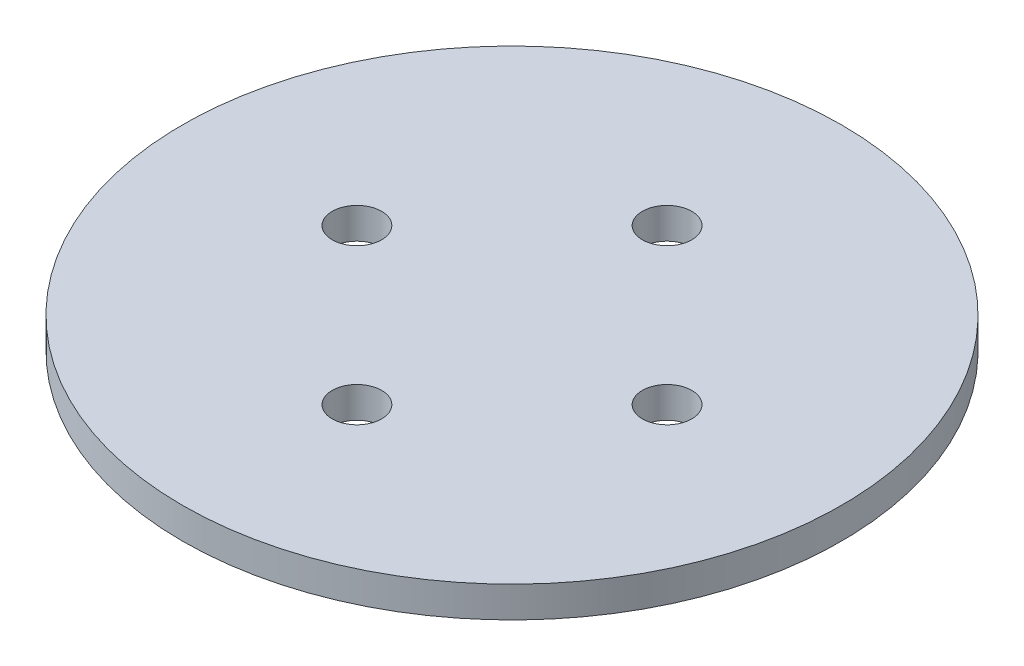
ISO-10303-21;
HEADER;
FILE_DESCRIPTION(('STEP AP214'),'2;1');
FILE_NAME('part.step','',(''),(''),'','','');
FILE_SCHEMA(('AUTOMOTIVE_DESIGN { 1 0 10303 214 1 1 1 1 }'));
ENDSEC;
DATA;
#1=APPLICATION_CONTEXT('core data for automotive mechanical design processes');
#2=APPLICATION_PROTOCOL_DEFINITION('international standard','automotive_design',2000,#1);
#3=PRODUCT_CONTEXT('',#1,'mechanical');
#4=PRODUCT('Part','Part','',(#3));
#5=PRODUCT_RELATED_PRODUCT_CATEGORY('part','',(#4));
#6=PRODUCT_DEFINITION_FORMATION('','',#4);
#7=PRODUCT_DEFINITION_CONTEXT('part definition',#1,'design');
#8=PRODUCT_DEFINITION('design','',#6,#7);
#9=PRODUCT_DEFINITION_SHAPE('','',#8);
#10=(LENGTH_UNIT() NAMED_UNIT(*) SI_UNIT(.MILLI.,.METRE.));
#11=(NAMED_UNIT(*) PLANE_ANGLE_UNIT() SI_UNIT($,.RADIAN.));
#12=(NAMED_UNIT(*) SI_UNIT($,.STERADIAN.) SOLID_ANGLE_UNIT());
#13=UNCERTAINTY_MEASURE_WITH_UNIT(LENGTH_MEASURE(1.E-05),#10,'distance_accuracy_value','');
#14=(GEOMETRIC_REPRESENTATION_CONTEXT(3) GLOBAL_UNCERTAINTY_ASSIGNED_CONTEXT((#13)) GLOBAL_UNIT_ASSIGNED_CONTEXT((#10,
#11,#12)) REPRESENTATION_CONTEXT('',''));
#15=CARTESIAN_POINT('',(0.,0.,0.));
#16=DIRECTION('',(0.,0.,1.));
#17=DIRECTION('',(1.,0.,0.));
#18=AXIS2_PLACEMENT_3D('',#15,#16,#17);
#19=CARTESIAN_POINT('',(0.,1.6,0.));
#20=DIRECTION('',(0.,-1.,0.));
#21=DIRECTION('',(0.,0.,-1.));
#22=AXIS2_PLACEMENT_3D('',#19,#20,#21);
#23=CYLINDRICAL_SURFACE('',#22,17.);
#24=CARTESIAN_POINT('',(0.,1.6,0.));
#25=DIRECTION('',(0.,1.,0.));
#26=DIRECTION('',(0.,0.,1.));
#27=AXIS2_PLACEMENT_3D('',#24,#25,#26);
#28=CIRCLE('',#27,17.);
#29=CARTESIAN_POINT('',(0.,1.6,17.));
#30=VERTEX_POINT('',#29);
#31=EDGE_CURVE('E10',#30,#30,#28,.T.);
#32=ORIENTED_EDGE('',*,*,#31,.F.);
#33=EDGE_LOOP('',(#32));
#34=FACE_BOUND('',#33,.T.);
#35=CARTESIAN_POINT('',(0.,0.,0.));
#36=DIRECTION('',(0.,1.,0.));
#37=DIRECTION('',(0.,0.,1.));
#38=AXIS2_PLACEMENT_3D('',#35,#36,#37);
#39=CIRCLE('',#38,17.);
#40=CARTESIAN_POINT('',(0.,0.,17.));
#41=VERTEX_POINT('',#40);
#42=EDGE_CURVE('E34',#41,#41,#39,.T.);
#43=ORIENTED_EDGE('',*,*,#42,.T.);
#44=EDGE_LOOP('',(#43));
#45=FACE_BOUND('',#44,.T.);
#46=ADVANCED_FACE('F31',(#34,#45),#23,.T.);
#47=CARTESIAN_POINT('',(0.,1.6,0.));
#48=DIRECTION('',(0.,1.,0.));
#49=DIRECTION('',(0.,0.,1.));
#50=AXIS2_PLACEMENT_3D('',#47,#48,#49);
#51=PLANE('',#50);
#52=CARTESIAN_POINT('',(8.,1.6,0.));
#53=DIRECTION('',(0.,1.,0.));
#54=DIRECTION('',(0.,0.,1.));
#55=AXIS2_PLACEMENT_3D('',#52,#53,#54);
#56=CIRCLE('',#55,1.275);
#57=CARTESIAN_POINT('',(8.,1.6,1.275));
#58=VERTEX_POINT('',#57);
#59=EDGE_CURVE('E61',#58,#58,#56,.T.);
#60=ORIENTED_EDGE('',*,*,#59,.F.);
#61=EDGE_LOOP('',(#60));
#62=FACE_BOUND('',#61,.T.);
#63=CARTESIAN_POINT('',(0.,1.6,8.));
#64=DIRECTION('',(0.,1.,0.));
#65=DIRECTION('',(0.,0.,1.));
#66=AXIS2_PLACEMENT_3D('',#63,#64,#65);
#67=CIRCLE('',#66,1.275);
#68=CARTESIAN_POINT('',(0.,1.6,9.275));
#69=VERTEX_POINT('',#68);
#70=EDGE_CURVE('E55',#69,#69,#67,.T.);
#71=ORIENTED_EDGE('',*,*,#70,.F.);
#72=EDGE_LOOP('',(#71));
#73=FACE_BOUND('',#72,.T.);
#74=CARTESIAN_POINT('',(-8.,1.6,0.));
#75=DIRECTION('',(0.,1.,0.));
#76=DIRECTION('',(0.,0.,1.));
#77=AXIS2_PLACEMENT_3D('',#74,#75,#76);
#78=CIRCLE('',#77,1.275);
#79=CARTESIAN_POINT('',(-8.,1.6,1.275));
#80=VERTEX_POINT('',#79);
#81=EDGE_CURVE('E49',#80,#80,#78,.T.);
#82=ORIENTED_EDGE('',*,*,#81,.F.);
#83=EDGE_LOOP('',(#82));
#84=FACE_BOUND('',#83,.T.);
#85=CARTESIAN_POINT('',(0.,1.6,-8.));
#86=DIRECTION('',(0.,1.,0.));
#87=DIRECTION('',(0.,0.,1.));
#88=AXIS2_PLACEMENT_3D('',#85,#86,#87);
#89=CIRCLE('',#88,1.275);
#90=CARTESIAN_POINT('',(0.,1.6,-6.725));
#91=VERTEX_POINT('',#90);
#92=EDGE_CURVE('E43',#91,#91,#89,.T.);
#93=ORIENTED_EDGE('',*,*,#92,.F.);
#94=EDGE_LOOP('',(#93));
#95=FACE_BOUND('',#94,.T.);
#96=ORIENTED_EDGE('',*,*,#31,.T.);
#97=EDGE_LOOP('',(#96));
#98=FACE_BOUND('',#97,.T.);
#99=ADVANCED_FACE('F77',(#62,#73,#84,#95,#98),#51,.T.);
#100=CARTESIAN_POINT('',(0.,0.,0.));
#101=DIRECTION('',(0.,1.,0.));
#102=DIRECTION('',(0.,0.,1.));
#103=AXIS2_PLACEMENT_3D('',#100,#101,#102);
#104=PLANE('',#103);
#105=CARTESIAN_POINT('',(8.,0.,0.));
#106=DIRECTION('',(0.,1.,0.));
#107=DIRECTION('',(0.,0.,1.));
#108=AXIS2_PLACEMENT_3D('',#105,#106,#107);
#109=CIRCLE('',#108,1.275);
#110=CARTESIAN_POINT('',(8.,0.,1.275));
#111=VERTEX_POINT('',#110);
#112=EDGE_CURVE('E41',#111,#111,#109,.T.);
#113=ORIENTED_EDGE('',*,*,#112,.T.);
#114=EDGE_LOOP('',(#113));
#115=FACE_BOUND('',#114,.T.);
#116=CARTESIAN_POINT('',(0.,0.,8.));
#117=DIRECTION('',(0.,1.,0.));
#118=DIRECTION('',(0.,0.,1.));
#119=AXIS2_PLACEMENT_3D('',#116,#117,#118);
#120=CIRCLE('',#119,1.275);
#121=CARTESIAN_POINT('',(0.,0.,9.275));
#122=VERTEX_POINT('',#121);
#123=EDGE_CURVE('E58',#122,#122,#120,.T.);
#124=ORIENTED_EDGE('',*,*,#123,.T.);
#125=EDGE_LOOP('',(#124));
#126=FACE_BOUND('',#125,.T.);
#127=CARTESIAN_POINT('',(-8.,0.,0.));
#128=DIRECTION('',(0.,1.,0.));
#129=DIRECTION('',(0.,0.,1.));
#130=AXIS2_PLACEMENT_3D('',#127,#128,#129);
#131=CIRCLE('',#130,1.275);
#132=CARTESIAN_POINT('',(-8.,0.,1.275));
#133=VERTEX_POINT('',#132);
#134=EDGE_CURVE('E52',#133,#133,#131,.T.);
#135=ORIENTED_EDGE('',*,*,#134,.T.);
#136=EDGE_LOOP('',(#135));
#137=FACE_BOUND('',#136,.T.);
#138=CARTESIAN_POINT('',(0.,0.,-8.));
#139=DIRECTION('',(0.,1.,0.));
#140=DIRECTION('',(0.,0.,1.));
#141=AXIS2_PLACEMENT_3D('',#138,#139,#140);
#142=CIRCLE('',#141,1.275);
#143=CARTESIAN_POINT('',(0.,0.,-6.725));
#144=VERTEX_POINT('',#143);
#145=EDGE_CURVE('E46',#144,#144,#142,.T.);
#146=ORIENTED_EDGE('',*,*,#145,.T.);
#147=EDGE_LOOP('',(#146));
#148=FACE_BOUND('',#147,.T.);
#149=ORIENTED_EDGE('',*,*,#42,.F.);
#150=EDGE_LOOP('',(#149));
#151=FACE_BOUND('',#150,.T.);
#152=ADVANCED_FACE('F67',(#115,#126,#137,#148,#151),#104,.F.);
#153=CARTESIAN_POINT('',(0.,0.,-8.));
#154=DIRECTION('',(0.,1.,0.));
#155=DIRECTION('',(0.,0.,1.));
#156=AXIS2_PLACEMENT_3D('',#153,#154,#155);
#157=CYLINDRICAL_SURFACE('',#156,1.275);
#158=ORIENTED_EDGE('',*,*,#145,.F.);
#159=EDGE_LOOP('',(#158));
#160=FACE_BOUND('',#159,.T.);
#161=ORIENTED_EDGE('',*,*,#92,.T.);
#162=EDGE_LOOP('',(#161));
#163=FACE_BOUND('',#162,.T.);
#164=ADVANCED_FACE('F87',(#160,#163),#157,.F.);
#165=CARTESIAN_POINT('',(-8.,0.,0.));
#166=DIRECTION('',(0.,1.,0.));
#167=DIRECTION('',(0.,0.,1.));
#168=AXIS2_PLACEMENT_3D('',#165,#166,#167);
#169=CYLINDRICAL_SURFACE('',#168,1.275);
#170=ORIENTED_EDGE('',*,*,#134,.F.);
#171=EDGE_LOOP('',(#170));
#172=FACE_BOUND('',#171,.T.);
#173=ORIENTED_EDGE('',*,*,#81,.T.);
#174=EDGE_LOOP('',(#173));
#175=FACE_BOUND('',#174,.T.);
#176=ADVANCED_FACE('F89',(#172,#175),#169,.F.);
#177=CARTESIAN_POINT('',(0.,0.,8.));
#178=DIRECTION('',(0.,1.,0.));
#179=DIRECTION('',(0.,0.,1.));
#180=AXIS2_PLACEMENT_3D('',#177,#178,#179);
#181=CYLINDRICAL_SURFACE('',#180,1.275);
#182=ORIENTED_EDGE('',*,*,#123,.F.);
#183=EDGE_LOOP('',(#182));
#184=FACE_BOUND('',#183,.T.);
#185=ORIENTED_EDGE('',*,*,#70,.T.);
#186=EDGE_LOOP('',(#185));
#187=FACE_BOUND('',#186,.T.);
#188=ADVANCED_FACE('F73',(#184,#187),#181,.F.);
#189=CARTESIAN_POINT('',(8.,0.,0.));
#190=DIRECTION('',(0.,1.,0.));
#191=DIRECTION('',(0.,0.,1.));
#192=AXIS2_PLACEMENT_3D('',#189,#190,#191);
#193=CYLINDRICAL_SURFACE('',#192,1.275);
#194=ORIENTED_EDGE('',*,*,#112,.F.);
#195=EDGE_LOOP('',(#194));
#196=FACE_BOUND('',#195,.T.);
#197=ORIENTED_EDGE('',*,*,#59,.T.);
#198=EDGE_LOOP('',(#197));
#199=FACE_BOUND('',#198,.T.);
#200=ADVANCED_FACE('F70',(#196,#199),#193,.F.);
#201=CLOSED_SHELL('',(#46,#99,#152,#164,#176,#188,#200));
#202=MANIFOLD_SOLID_BREP('B2',#201);
#203=ADVANCED_BREP_SHAPE_REPRESENTATION('',(#18,#202),#14);
#204=SHAPE_DEFINITION_REPRESENTATION(#9,#203);
ENDSEC;
END-ISO-10303-21;
